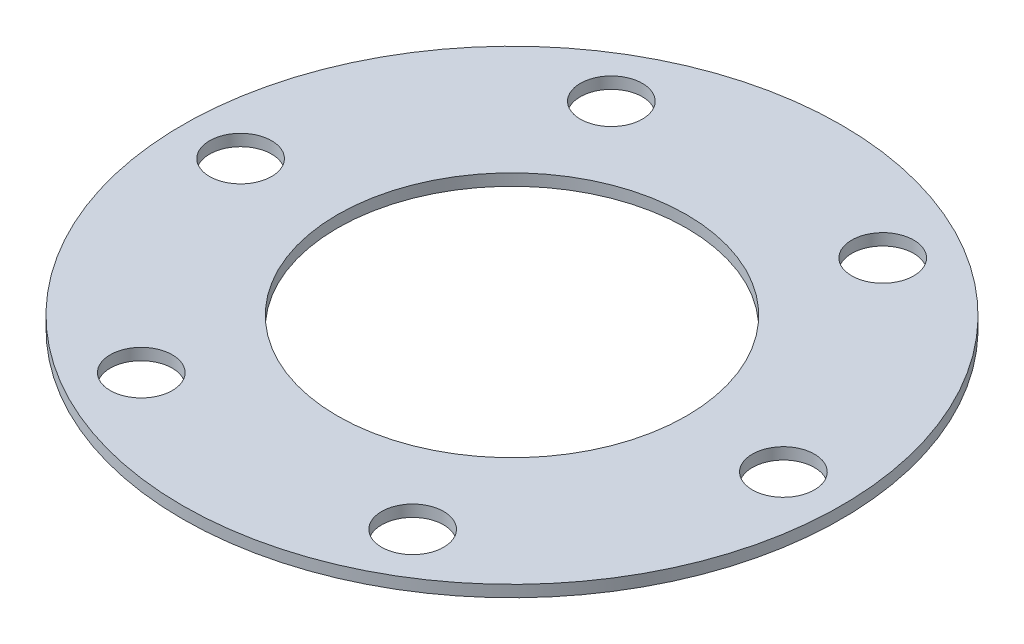
ISO-10303-21;
HEADER;
FILE_DESCRIPTION(('STEP AP214'),'2;1');
FILE_NAME('part.step','',(''),(''),'','','');
FILE_SCHEMA(('AUTOMOTIVE_DESIGN { 1 0 10303 214 1 1 1 1 }'));
ENDSEC;
DATA;
#1=APPLICATION_CONTEXT('core data for automotive mechanical design processes');
#2=APPLICATION_PROTOCOL_DEFINITION('international standard','automotive_design',2000,#1);
#3=PRODUCT_CONTEXT('',#1,'mechanical');
#4=PRODUCT('Part','Part','',(#3));
#5=PRODUCT_RELATED_PRODUCT_CATEGORY('part','',(#4));
#6=PRODUCT_DEFINITION_FORMATION('','',#4);
#7=PRODUCT_DEFINITION_CONTEXT('part definition',#1,'design');
#8=PRODUCT_DEFINITION('design','',#6,#7);
#9=PRODUCT_DEFINITION_SHAPE('','',#8);
#10=(LENGTH_UNIT() NAMED_UNIT(*) SI_UNIT(.MILLI.,.METRE.));
#11=(NAMED_UNIT(*) PLANE_ANGLE_UNIT() SI_UNIT($,.RADIAN.));
#12=(NAMED_UNIT(*) SI_UNIT($,.STERADIAN.) SOLID_ANGLE_UNIT());
#13=UNCERTAINTY_MEASURE_WITH_UNIT(LENGTH_MEASURE(1.E-05),#10,'distance_accuracy_value','');
#14=(GEOMETRIC_REPRESENTATION_CONTEXT(3) GLOBAL_UNCERTAINTY_ASSIGNED_CONTEXT((#13)) GLOBAL_UNIT_ASSIGNED_CONTEXT((#10,
#11,#12)) REPRESENTATION_CONTEXT('',''));
#15=CARTESIAN_POINT('',(0.,0.,0.));
#16=DIRECTION('',(0.,0.,1.));
#17=DIRECTION('',(1.,0.,0.));
#18=AXIS2_PLACEMENT_3D('',#15,#16,#17);
#19=CARTESIAN_POINT('',(0.,1.5,0.));
#20=DIRECTION('',(0.,1.,0.));
#21=DIRECTION('',(0.,0.,1.));
#22=AXIS2_PLACEMENT_3D('',#19,#20,#21);
#23=PLANE('',#22);
#24=CARTESIAN_POINT('',(70.,1.5,0.));
#25=DIRECTION('',(0.,1.,0.));
#26=DIRECTION('',(0.,0.,1.));
#27=AXIS2_PLACEMENT_3D('',#24,#25,#26);
#28=CIRCLE('',#27,8.);
#29=CARTESIAN_POINT('',(70.,1.5,8.));
#30=VERTEX_POINT('',#29);
#31=EDGE_CURVE('E79',#30,#30,#28,.T.);
#32=ORIENTED_EDGE('',*,*,#31,.F.);
#33=EDGE_LOOP('',(#32));
#34=FACE_BOUND('',#33,.T.);
#35=CARTESIAN_POINT('',(35.,1.5,-60.6217782649107));
#36=DIRECTION('',(0.,1.,0.));
#37=DIRECTION('',(0.,0.,1.));
#38=AXIS2_PLACEMENT_3D('',#35,#36,#37);
#39=CIRCLE('',#38,7.99999999999998);
#40=CARTESIAN_POINT('',(35.,1.5,-52.6217782649108));
#41=VERTEX_POINT('',#40);
#42=EDGE_CURVE('E58',#41,#41,#39,.T.);
#43=ORIENTED_EDGE('',*,*,#42,.F.);
#44=EDGE_LOOP('',(#43));
#45=FACE_BOUND('',#44,.T.);
#46=CARTESIAN_POINT('',(-35.,1.5,-60.6217782649107));
#47=DIRECTION('',(0.,1.,0.));
#48=DIRECTION('',(0.,0.,1.));
#49=AXIS2_PLACEMENT_3D('',#46,#47,#48);
#50=CIRCLE('',#49,7.99999999999999);
#51=CARTESIAN_POINT('',(-35.,1.5,-52.6217782649107));
#52=VERTEX_POINT('',#51);
#53=EDGE_CURVE('E57',#52,#52,#50,.T.);
#54=ORIENTED_EDGE('',*,*,#53,.F.);
#55=EDGE_LOOP('',(#54));
#56=FACE_BOUND('',#55,.T.);
#57=CARTESIAN_POINT('',(-70.,1.5,0.));
#58=DIRECTION('',(0.,1.,0.));
#59=DIRECTION('',(0.,0.,1.));
#60=AXIS2_PLACEMENT_3D('',#57,#58,#59);
#61=CIRCLE('',#60,7.99999999999999);
#62=CARTESIAN_POINT('',(-70.,1.5,8.));
#63=VERTEX_POINT('',#62);
#64=EDGE_CURVE('E64',#63,#63,#61,.T.);
#65=ORIENTED_EDGE('',*,*,#64,.F.);
#66=EDGE_LOOP('',(#65));
#67=FACE_BOUND('',#66,.T.);
#68=CARTESIAN_POINT('',(-35.,1.5,60.6217782649107));
#69=DIRECTION('',(0.,1.,0.));
#70=DIRECTION('',(0.,0.,1.));
#71=AXIS2_PLACEMENT_3D('',#68,#69,#70);
#72=CIRCLE('',#71,8.);
#73=CARTESIAN_POINT('',(-35.,1.5,68.6217782649107));
#74=VERTEX_POINT('',#73);
#75=EDGE_CURVE('E70',#74,#74,#72,.T.);
#76=ORIENTED_EDGE('',*,*,#75,.F.);
#77=EDGE_LOOP('',(#76));
#78=FACE_BOUND('',#77,.T.);
#79=CARTESIAN_POINT('',(35.,1.5,60.6217782649107));
#80=DIRECTION('',(0.,1.,0.));
#81=DIRECTION('',(0.,0.,1.));
#82=AXIS2_PLACEMENT_3D('',#79,#80,#81);
#83=CIRCLE('',#82,8.00000000000001);
#84=CARTESIAN_POINT('',(35.,1.5,68.6217782649107));
#85=VERTEX_POINT('',#84);
#86=EDGE_CURVE('E76',#85,#85,#83,.T.);
#87=ORIENTED_EDGE('',*,*,#86,.F.);
#88=EDGE_LOOP('',(#87));
#89=FACE_BOUND('',#88,.T.);
#90=CARTESIAN_POINT('',(0.,1.5,0.));
#91=DIRECTION('',(0.,1.,0.));
#92=DIRECTION('',(0.,0.,1.));
#93=AXIS2_PLACEMENT_3D('',#90,#91,#92);
#94=CIRCLE('',#93,85.);
#95=CARTESIAN_POINT('',(0.,1.5,85.));
#96=VERTEX_POINT('',#95);
#97=EDGE_CURVE('E10',#96,#96,#94,.T.);
#98=ORIENTED_EDGE('',*,*,#97,.T.);
#99=EDGE_LOOP('',(#98));
#100=FACE_BOUND('',#99,.T.);
#101=CARTESIAN_POINT('',(0.,1.5,0.));
#102=DIRECTION('',(0.,1.,0.));
#103=DIRECTION('',(0.,0.,1.));
#104=AXIS2_PLACEMENT_3D('',#101,#102,#103);
#105=CIRCLE('',#104,45.);
#106=CARTESIAN_POINT('',(0.,1.5,45.));
#107=VERTEX_POINT('',#106);
#108=EDGE_CURVE('E46',#107,#107,#105,.T.);
#109=ORIENTED_EDGE('',*,*,#108,.F.);
#110=EDGE_LOOP('',(#109));
#111=FACE_BOUND('',#110,.T.);
#112=ADVANCED_FACE('F35',(#34,#45,#56,#67,#78,#89,#100,#111),#23,.T.);
#113=CARTESIAN_POINT('',(0.,-1.5,0.));
#114=DIRECTION('',(0.,1.,0.));
#115=DIRECTION('',(0.,0.,1.));
#116=AXIS2_PLACEMENT_3D('',#113,#114,#115);
#117=PLANE('',#116);
#118=CARTESIAN_POINT('',(70.,-1.5,0.));
#119=DIRECTION('',(0.,1.,0.));
#120=DIRECTION('',(0.,0.,1.));
#121=AXIS2_PLACEMENT_3D('',#118,#119,#120);
#122=CIRCLE('',#121,8.);
#123=CARTESIAN_POINT('',(70.,-1.5,8.));
#124=VERTEX_POINT('',#123);
#125=EDGE_CURVE('E51',#124,#124,#122,.T.);
#126=ORIENTED_EDGE('',*,*,#125,.T.);
#127=EDGE_LOOP('',(#126));
#128=FACE_BOUND('',#127,.T.);
#129=CARTESIAN_POINT('',(35.,-1.5,-60.6217782649107));
#130=DIRECTION('',(0.,1.,0.));
#131=DIRECTION('',(0.,0.,1.));
#132=AXIS2_PLACEMENT_3D('',#129,#130,#131);
#133=CIRCLE('',#132,7.99999999999998);
#134=CARTESIAN_POINT('',(35.,-1.5,-52.6217782649108));
#135=VERTEX_POINT('',#134);
#136=EDGE_CURVE('E80',#135,#135,#133,.T.);
#137=ORIENTED_EDGE('',*,*,#136,.T.);
#138=EDGE_LOOP('',(#137));
#139=FACE_BOUND('',#138,.T.);
#140=CARTESIAN_POINT('',(-35.,-1.5,-60.6217782649107));
#141=DIRECTION('',(0.,1.,0.));
#142=DIRECTION('',(0.,0.,1.));
#143=AXIS2_PLACEMENT_3D('',#140,#141,#142);
#144=CIRCLE('',#143,7.99999999999999);
#145=CARTESIAN_POINT('',(-35.,-1.5,-52.6217782649107));
#146=VERTEX_POINT('',#145);
#147=EDGE_CURVE('E54',#146,#146,#144,.T.);
#148=ORIENTED_EDGE('',*,*,#147,.T.);
#149=EDGE_LOOP('',(#148));
#150=FACE_BOUND('',#149,.T.);
#151=CARTESIAN_POINT('',(-70.,-1.5,0.));
#152=DIRECTION('',(0.,1.,0.));
#153=DIRECTION('',(0.,0.,1.));
#154=AXIS2_PLACEMENT_3D('',#151,#152,#153);
#155=CIRCLE('',#154,7.99999999999999);
#156=CARTESIAN_POINT('',(-70.,-1.5,8.));
#157=VERTEX_POINT('',#156);
#158=EDGE_CURVE('E61',#157,#157,#155,.T.);
#159=ORIENTED_EDGE('',*,*,#158,.T.);
#160=EDGE_LOOP('',(#159));
#161=FACE_BOUND('',#160,.T.);
#162=CARTESIAN_POINT('',(-35.,-1.5,60.6217782649107));
#163=DIRECTION('',(0.,1.,0.));
#164=DIRECTION('',(0.,0.,1.));
#165=AXIS2_PLACEMENT_3D('',#162,#163,#164);
#166=CIRCLE('',#165,8.);
#167=CARTESIAN_POINT('',(-35.,-1.5,68.6217782649107));
#168=VERTEX_POINT('',#167);
#169=EDGE_CURVE('E67',#168,#168,#166,.T.);
#170=ORIENTED_EDGE('',*,*,#169,.T.);
#171=EDGE_LOOP('',(#170));
#172=FACE_BOUND('',#171,.T.);
#173=CARTESIAN_POINT('',(35.,-1.5,60.6217782649107));
#174=DIRECTION('',(0.,1.,0.));
#175=DIRECTION('',(0.,0.,1.));
#176=AXIS2_PLACEMENT_3D('',#173,#174,#175);
#177=CIRCLE('',#176,8.00000000000001);
#178=CARTESIAN_POINT('',(35.,-1.5,68.6217782649107));
#179=VERTEX_POINT('',#178);
#180=EDGE_CURVE('E73',#179,#179,#177,.T.);
#181=ORIENTED_EDGE('',*,*,#180,.T.);
#182=EDGE_LOOP('',(#181));
#183=FACE_BOUND('',#182,.T.);
#184=CARTESIAN_POINT('',(0.,-1.5,0.));
#185=DIRECTION('',(0.,1.,0.));
#186=DIRECTION('',(0.,0.,1.));
#187=AXIS2_PLACEMENT_3D('',#184,#185,#186);
#188=CIRCLE('',#187,85.);
#189=CARTESIAN_POINT('',(0.,-1.5,85.));
#190=VERTEX_POINT('',#189);
#191=EDGE_CURVE('E39',#190,#190,#188,.T.);
#192=ORIENTED_EDGE('',*,*,#191,.F.);
#193=EDGE_LOOP('',(#192));
#194=FACE_BOUND('',#193,.T.);
#195=CARTESIAN_POINT('',(0.,-1.5,0.));
#196=DIRECTION('',(0.,1.,0.));
#197=DIRECTION('',(0.,0.,1.));
#198=AXIS2_PLACEMENT_3D('',#195,#196,#197);
#199=CIRCLE('',#198,45.);
#200=CARTESIAN_POINT('',(0.,-1.5,45.));
#201=VERTEX_POINT('',#200);
#202=EDGE_CURVE('E48',#201,#201,#199,.T.);
#203=ORIENTED_EDGE('',*,*,#202,.T.);
#204=EDGE_LOOP('',(#203));
#205=FACE_BOUND('',#204,.T.);
#206=ADVANCED_FACE('F90',(#128,#139,#150,#161,#172,#183,#194,#205),#117,.F.);
#207=CARTESIAN_POINT('',(0.,1.5,0.));
#208=DIRECTION('',(0.,-1.,0.));
#209=DIRECTION('',(0.,0.,-1.));
#210=AXIS2_PLACEMENT_3D('',#207,#208,#209);
#211=CYLINDRICAL_SURFACE('',#210,85.);
#212=ORIENTED_EDGE('',*,*,#97,.F.);
#213=EDGE_LOOP('',(#212));
#214=FACE_BOUND('',#213,.T.);
#215=ORIENTED_EDGE('',*,*,#191,.T.);
#216=EDGE_LOOP('',(#215));
#217=FACE_BOUND('',#216,.T.);
#218=ADVANCED_FACE('F37',(#214,#217),#211,.T.);
#219=CARTESIAN_POINT('',(0.,1.5,0.));
#220=DIRECTION('',(0.,-1.,0.));
#221=DIRECTION('',(0.,0.,-1.));
#222=AXIS2_PLACEMENT_3D('',#219,#220,#221);
#223=CYLINDRICAL_SURFACE('',#222,45.);
#224=ORIENTED_EDGE('',*,*,#108,.T.);
#225=EDGE_LOOP('',(#224));
#226=FACE_BOUND('',#225,.T.);
#227=ORIENTED_EDGE('',*,*,#202,.F.);
#228=EDGE_LOOP('',(#227));
#229=FACE_BOUND('',#228,.T.);
#230=ADVANCED_FACE('F115',(#226,#229),#223,.F.);
#231=CARTESIAN_POINT('',(35.,-1.5,60.6217782649107));
#232=DIRECTION('',(0.,1.,0.));
#233=DIRECTION('',(0.,0.,1.));
#234=AXIS2_PLACEMENT_3D('',#231,#232,#233);
#235=CYLINDRICAL_SURFACE('',#234,8.00000000000001);
#236=ORIENTED_EDGE('',*,*,#180,.F.);
#237=EDGE_LOOP('',(#236));
#238=FACE_BOUND('',#237,.T.);
#239=ORIENTED_EDGE('',*,*,#86,.T.);
#240=EDGE_LOOP('',(#239));
#241=FACE_BOUND('',#240,.T.);
#242=ADVANCED_FACE('F118',(#238,#241),#235,.F.);
#243=CARTESIAN_POINT('',(-35.,-1.5,60.6217782649107));
#244=DIRECTION('',(0.,1.,0.));
#245=DIRECTION('',(0.,0.,1.));
#246=AXIS2_PLACEMENT_3D('',#243,#244,#245);
#247=CYLINDRICAL_SURFACE('',#246,8.);
#248=ORIENTED_EDGE('',*,*,#169,.F.);
#249=EDGE_LOOP('',(#248));
#250=FACE_BOUND('',#249,.T.);
#251=ORIENTED_EDGE('',*,*,#75,.T.);
#252=EDGE_LOOP('',(#251));
#253=FACE_BOUND('',#252,.T.);
#254=ADVANCED_FACE('F136',(#250,#253),#247,.F.);
#255=CARTESIAN_POINT('',(-70.,-1.5,0.));
#256=DIRECTION('',(0.,1.,0.));
#257=DIRECTION('',(0.,0.,1.));
#258=AXIS2_PLACEMENT_3D('',#255,#256,#257);
#259=CYLINDRICAL_SURFACE('',#258,7.99999999999999);
#260=ORIENTED_EDGE('',*,*,#158,.F.);
#261=EDGE_LOOP('',(#260));
#262=FACE_BOUND('',#261,.T.);
#263=ORIENTED_EDGE('',*,*,#64,.T.);
#264=EDGE_LOOP('',(#263));
#265=FACE_BOUND('',#264,.T.);
#266=ADVANCED_FACE('F132',(#262,#265),#259,.F.);
#267=CARTESIAN_POINT('',(-35.,-1.5,-60.6217782649107));
#268=DIRECTION('',(0.,1.,0.));
#269=DIRECTION('',(0.,0.,1.));
#270=AXIS2_PLACEMENT_3D('',#267,#268,#269);
#271=CYLINDRICAL_SURFACE('',#270,7.99999999999999);
#272=ORIENTED_EDGE('',*,*,#147,.F.);
#273=EDGE_LOOP('',(#272));
#274=FACE_BOUND('',#273,.T.);
#275=ORIENTED_EDGE('',*,*,#53,.T.);
#276=EDGE_LOOP('',(#275));
#277=FACE_BOUND('',#276,.T.);
#278=ADVANCED_FACE('F129',(#274,#277),#271,.F.);
#279=CARTESIAN_POINT('',(35.,-1.5,-60.6217782649107));
#280=DIRECTION('',(0.,1.,0.));
#281=DIRECTION('',(0.,0.,1.));
#282=AXIS2_PLACEMENT_3D('',#279,#280,#281);
#283=CYLINDRICAL_SURFACE('',#282,7.99999999999998);
#284=ORIENTED_EDGE('',*,*,#136,.F.);
#285=EDGE_LOOP('',(#284));
#286=FACE_BOUND('',#285,.T.);
#287=ORIENTED_EDGE('',*,*,#42,.T.);
#288=EDGE_LOOP('',(#287));
#289=FACE_BOUND('',#288,.T.);
#290=ADVANCED_FACE('F96',(#286,#289),#283,.F.);
#291=CARTESIAN_POINT('',(70.,-1.5,0.));
#292=DIRECTION('',(0.,1.,0.));
#293=DIRECTION('',(0.,0.,1.));
#294=AXIS2_PLACEMENT_3D('',#291,#292,#293);
#295=CYLINDRICAL_SURFACE('',#294,8.);
#296=ORIENTED_EDGE('',*,*,#125,.F.);
#297=EDGE_LOOP('',(#296));
#298=FACE_BOUND('',#297,.T.);
#299=ORIENTED_EDGE('',*,*,#31,.T.);
#300=EDGE_LOOP('',(#299));
#301=FACE_BOUND('',#300,.T.);
#302=ADVANCED_FACE('F93',(#298,#301),#295,.F.);
#303=CLOSED_SHELL('',(#112,#206,#218,#230,#242,#254,#266,#278,#290,#302));
#304=MANIFOLD_SOLID_BREP('B2',#303);
#305=ADVANCED_BREP_SHAPE_REPRESENTATION('',(#18,#304),#14);
#306=SHAPE_DEFINITION_REPRESENTATION(#9,#305);
ENDSEC;
END-ISO-10303-21;
